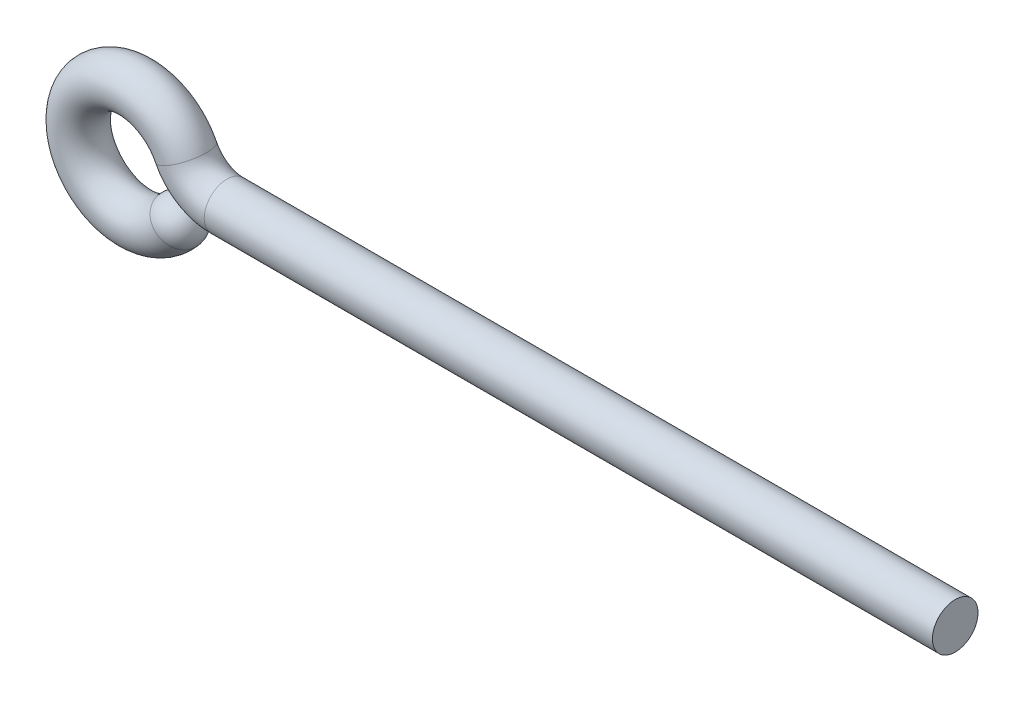
ISO-10303-21;
HEADER;
FILE_DESCRIPTION(('STEP AP214'),'2;1');
FILE_NAME('part.step','',(''),(''),'','','');
FILE_SCHEMA(('AUTOMOTIVE_DESIGN { 1 0 10303 214 1 1 1 1 }'));
ENDSEC;
DATA;
#1=APPLICATION_CONTEXT('core data for automotive mechanical design processes');
#2=APPLICATION_PROTOCOL_DEFINITION('international standard','automotive_design',2000,#1);
#3=PRODUCT_CONTEXT('',#1,'mechanical');
#4=PRODUCT('Part','Part','',(#3));
#5=PRODUCT_RELATED_PRODUCT_CATEGORY('part','',(#4));
#6=PRODUCT_DEFINITION_FORMATION('','',#4);
#7=PRODUCT_DEFINITION_CONTEXT('part definition',#1,'design');
#8=PRODUCT_DEFINITION('design','',#6,#7);
#9=PRODUCT_DEFINITION_SHAPE('','',#8);
#10=(LENGTH_UNIT() NAMED_UNIT(*) SI_UNIT(.MILLI.,.METRE.));
#11=(NAMED_UNIT(*) PLANE_ANGLE_UNIT() SI_UNIT($,.RADIAN.));
#12=(NAMED_UNIT(*) SI_UNIT($,.STERADIAN.) SOLID_ANGLE_UNIT());
#13=UNCERTAINTY_MEASURE_WITH_UNIT(LENGTH_MEASURE(1.E-05),#10,'distance_accuracy_value','');
#14=(GEOMETRIC_REPRESENTATION_CONTEXT(3) GLOBAL_UNCERTAINTY_ASSIGNED_CONTEXT((#13)) GLOBAL_UNIT_ASSIGNED_CONTEXT((#10,
#11,#12)) REPRESENTATION_CONTEXT('',''));
#15=CARTESIAN_POINT('',(0.,0.,0.));
#16=DIRECTION('',(0.,0.,1.));
#17=DIRECTION('',(1.,0.,0.));
#18=AXIS2_PLACEMENT_3D('',#15,#16,#17);
#19=CARTESIAN_POINT('',(-4.08488889220255,-1.60696902421634,0.));
#20=DIRECTION('',(0.,0.,1.));
#21=DIRECTION('',(1.,0.,0.));
#22=AXIS2_PLACEMENT_3D('',#19,#20,#21);
#23=SPHERICAL_SURFACE('',#22,1.);
#24=CARTESIAN_POINT('',(-4.08488889220255,-1.60696902421634,0.));
#25=DIRECTION('',(-0.642787609686536,-0.766044443118981,0.));
#26=DIRECTION('',(0.,0.,-1.));
#27=AXIS2_PLACEMENT_3D('',#24,#25,#26);
#28=SPHERICAL_SURFACE('',#27,1.);
#29=CARTESIAN_POINT('',(-4.08488889220255,-1.60696902421634,0.));
#30=DIRECTION('',(-0.642787609686535,-0.766044443118981,0.));
#31=DIRECTION('',(0.,0.,-1.));
#32=AXIS2_PLACEMENT_3D('',#29,#30,#31);
#33=CIRCLE('',#32,1.);
#34=CARTESIAN_POINT('',(-4.08488889220255,-1.60696902421634,-1.));
#35=VERTEX_POINT('',#34);
#36=EDGE_CURVE('E11',#35,#35,#33,.T.);
#37=ORIENTED_EDGE('',*,*,#36,.F.);
#38=EDGE_LOOP('',(#37));
#39=FACE_BOUND('',#38,.T.);
#40=ADVANCED_FACE('F39',(#39),#28,.T.);
#41=CARTESIAN_POINT('',(0.,0.,0.));
#42=DIRECTION('',(-1.,0.,0.));
#43=DIRECTION('',(0.,-1.,0.));
#44=AXIS2_PLACEMENT_3D('',#41,#42,#43);
#45=CYLINDRICAL_SURFACE('',#44,1.);
#46=CARTESIAN_POINT('',(-1.96887112585072,0.,0.));
#47=DIRECTION('',(1.,0.,0.));
#48=DIRECTION('',(0.,0.,-1.));
#49=AXIS2_PLACEMENT_3D('',#46,#47,#48);
#50=CIRCLE('',#49,1.);
#51=CARTESIAN_POINT('',(-1.96887112585072,-1.,0.));
#52=VERTEX_POINT('',#51);
#53=EDGE_CURVE('E76',#52,#52,#50,.T.);
#54=ORIENTED_EDGE('',*,*,#53,.T.);
#55=EDGE_LOOP('',(#54));
#56=FACE_BOUND('',#55,.T.);
#57=CARTESIAN_POINT('',(30.,0.,0.));
#58=DIRECTION('',(1.,0.,0.));
#59=DIRECTION('',(0.,0.,-1.));
#60=AXIS2_PLACEMENT_3D('',#57,#58,#59);
#61=CIRCLE('',#60,1.);
#62=CARTESIAN_POINT('',(30.,0.,-1.));
#63=VERTEX_POINT('',#62);
#64=EDGE_CURVE('E77',#63,#63,#61,.T.);
#65=ORIENTED_EDGE('',*,*,#64,.F.);
#66=EDGE_LOOP('',(#65));
#67=FACE_BOUND('',#66,.T.);
#68=ADVANCED_FACE('F52',(#56,#67),#45,.T.);
#69=CARTESIAN_POINT('',(-1.96887112585072,2.,0.));
#70=DIRECTION('',(0.,0.,-1.));
#71=DIRECTION('',(-1.,0.,0.));
#72=AXIS2_PLACEMENT_3D('',#69,#70,#71);
#73=TOROIDAL_SURFACE('',#72,2.,1.);
#74=CARTESIAN_POINT('',(-3.76048395880596,1.11111111111111,0.));
#75=DIRECTION('',(0.444444444444444,-0.895806416477617,0.));
#76=DIRECTION('',(0.,0.,-1.));
#77=AXIS2_PLACEMENT_3D('',#74,#75,#76);
#78=CIRCLE('',#77,1.);
#79=CARTESIAN_POINT('',(-4.65629037528358,0.666666666666669,0.));
#80=VERTEX_POINT('',#79);
#81=EDGE_CURVE('E45',#80,#80,#78,.T.);
#82=CARTESIAN_POINT('',(-1.96887112585072,2.,0.));
#83=DIRECTION('',(0.,0.,-1.));
#84=DIRECTION('',(-1.,0.,0.));
#85=AXIS2_PLACEMENT_3D('',#82,#83,#84);
#86=CIRCLE('',#85,3.);
#87=EDGE_CURVE('',#52,#80,#86,.T.);
#88=ORIENTED_EDGE('',*,*,#53,.F.);
#89=ORIENTED_EDGE('',*,*,#81,.T.);
#90=ORIENTED_EDGE('',*,*,#87,.T.);
#91=ORIENTED_EDGE('',*,*,#87,.F.);
#92=EDGE_LOOP('',(#88,#90,#89,#91));
#93=FACE_BOUND('',#92,.T.);
#94=ADVANCED_FACE('F57',(#93),#73,.T.);
#95=CARTESIAN_POINT('',(-6.,0.,0.));
#96=DIRECTION('',(0.,0.,1.));
#97=DIRECTION('',(1.,0.,0.));
#98=AXIS2_PLACEMENT_3D('',#95,#96,#97);
#99=TOROIDAL_SURFACE('',#98,2.5,1.);
#100=ORIENTED_EDGE('',*,*,#36,.T.);
#101=EDGE_LOOP('',(#100));
#102=FACE_BOUND('',#101,.T.);
#103=ORIENTED_EDGE('',*,*,#81,.F.);
#104=EDGE_LOOP('',(#103));
#105=FACE_BOUND('',#104,.T.);
#106=ADVANCED_FACE('F48',(#102,#105),#99,.T.);
#107=CARTESIAN_POINT('',(30.,0.,0.));
#108=DIRECTION('',(1.,0.,0.));
#109=DIRECTION('',(0.,0.,-1.));
#110=AXIS2_PLACEMENT_3D('',#107,#108,#109);
#111=PLANE('',#110);
#112=ORIENTED_EDGE('',*,*,#64,.T.);
#113=EDGE_LOOP('',(#112));
#114=FACE_BOUND('',#113,.T.);
#115=ADVANCED_FACE('F53',(#114),#111,.T.);
#116=CLOSED_SHELL('',(#40,#68,#94,#106,#115));
#117=MANIFOLD_SOLID_BREP('B2',#116);
#118=ADVANCED_BREP_SHAPE_REPRESENTATION('',(#18,#117),#14);
#119=SHAPE_DEFINITION_REPRESENTATION(#9,#118);
ENDSEC;
END-ISO-10303-21;
